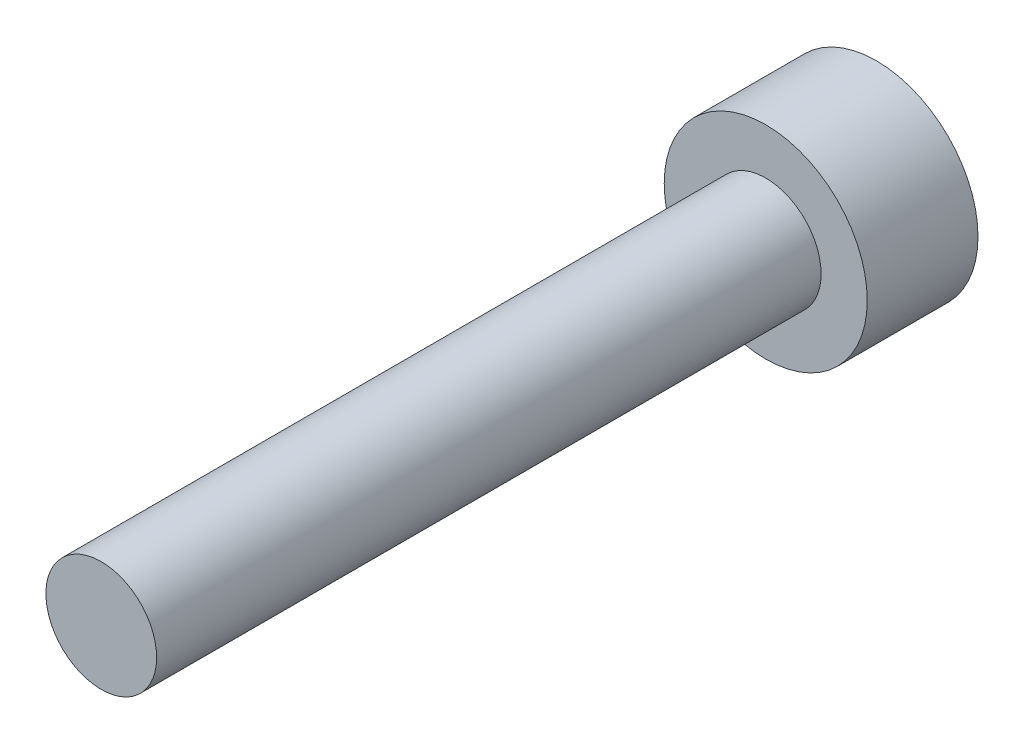
ISO-10303-21;
HEADER;
FILE_DESCRIPTION(('STEP AP214'),'2;1');
FILE_NAME('part.step','',(''),(''),'','','');
FILE_SCHEMA(('AUTOMOTIVE_DESIGN { 1 0 10303 214 1 1 1 1 }'));
ENDSEC;
DATA;
#1=APPLICATION_CONTEXT('core data for automotive mechanical design processes');
#2=APPLICATION_PROTOCOL_DEFINITION('international standard','automotive_design',2000,#1);
#3=PRODUCT_CONTEXT('',#1,'mechanical');
#4=PRODUCT('Part','Part','',(#3));
#5=PRODUCT_RELATED_PRODUCT_CATEGORY('part','',(#4));
#6=PRODUCT_DEFINITION_FORMATION('','',#4);
#7=PRODUCT_DEFINITION_CONTEXT('part definition',#1,'design');
#8=PRODUCT_DEFINITION('design','',#6,#7);
#9=PRODUCT_DEFINITION_SHAPE('','',#8);
#10=(LENGTH_UNIT() NAMED_UNIT(*) SI_UNIT(.MILLI.,.METRE.));
#11=(NAMED_UNIT(*) PLANE_ANGLE_UNIT() SI_UNIT($,.RADIAN.));
#12=(NAMED_UNIT(*) SI_UNIT($,.STERADIAN.) SOLID_ANGLE_UNIT());
#13=UNCERTAINTY_MEASURE_WITH_UNIT(LENGTH_MEASURE(1.E-05),#10,'distance_accuracy_value','');
#14=(GEOMETRIC_REPRESENTATION_CONTEXT(3) GLOBAL_UNCERTAINTY_ASSIGNED_CONTEXT((#13)) GLOBAL_UNIT_ASSIGNED_CONTEXT((#10,
#11,#12)) REPRESENTATION_CONTEXT('',''));
#15=CARTESIAN_POINT('',(0.,0.,0.));
#16=DIRECTION('',(0.,0.,1.));
#17=DIRECTION('',(1.,0.,0.));
#18=AXIS2_PLACEMENT_3D('',#15,#16,#17);
#19=CARTESIAN_POINT('',(0.,0.,-3.));
#20=DIRECTION('',(0.,0.,1.));
#21=DIRECTION('',(1.,0.,0.));
#22=AXIS2_PLACEMENT_3D('',#19,#20,#21);
#23=PLANE('',#22);
#24=CARTESIAN_POINT('',(0.,0.,-3.));
#25=DIRECTION('',(0.,0.,1.));
#26=DIRECTION('',(1.,0.,0.));
#27=AXIS2_PLACEMENT_3D('',#24,#25,#26);
#28=CIRCLE('',#27,2.75);
#29=CARTESIAN_POINT('',(2.75,0.,-3.));
#30=VERTEX_POINT('',#29);
#31=EDGE_CURVE('E112',#30,#30,#28,.T.);
#32=ORIENTED_EDGE('',*,*,#31,.F.);
#33=EDGE_LOOP('',(#32));
#34=FACE_BOUND('',#33,.T.);
#35=DIRECTION('',(-0.5,-0.866025403784439,0.));
#36=VECTOR('',#35,1.);
#37=CARTESIAN_POINT('',(1.08253175473055,-0.625,-3.));
#38=LINE('',#37,#36);
#39=CARTESIAN_POINT('',(1.44337567297406,0.,-3.));
#40=VERTEX_POINT('',#39);
#41=CARTESIAN_POINT('',(0.721687836487032,-1.25,-3.));
#42=VERTEX_POINT('',#41);
#43=EDGE_CURVE('E11',#40,#42,#38,.T.);
#44=ORIENTED_EDGE('',*,*,#43,.F.);
#45=DIRECTION('',(0.5,-0.866025403784439,0.));
#46=VECTOR('',#45,1.);
#47=CARTESIAN_POINT('',(1.08253175473055,0.625,-3.));
#48=LINE('',#47,#46);
#49=CARTESIAN_POINT('',(0.721687836487032,1.25,-3.));
#50=VERTEX_POINT('',#49);
#51=EDGE_CURVE('E50',#50,#40,#48,.T.);
#52=ORIENTED_EDGE('',*,*,#51,.F.);
#53=DIRECTION('',(1.,0.,0.));
#54=VECTOR('',#53,1.);
#55=CARTESIAN_POINT('',(0.,1.25,-3.));
#56=LINE('',#55,#54);
#57=CARTESIAN_POINT('',(-0.721687836487032,1.25,-3.));
#58=VERTEX_POINT('',#57);
#59=EDGE_CURVE('E133',#58,#50,#56,.T.);
#60=ORIENTED_EDGE('',*,*,#59,.F.);
#61=DIRECTION('',(0.5,0.866025403784439,0.));
#62=VECTOR('',#61,1.);
#63=CARTESIAN_POINT('',(-1.08253175473055,0.625,-3.));
#64=LINE('',#63,#62);
#65=CARTESIAN_POINT('',(-1.44337567297406,0.,-3.));
#66=VERTEX_POINT('',#65);
#67=EDGE_CURVE('E129',#66,#58,#64,.T.);
#68=ORIENTED_EDGE('',*,*,#67,.F.);
#69=DIRECTION('',(-0.5,0.866025403784439,0.));
#70=VECTOR('',#69,1.);
#71=CARTESIAN_POINT('',(-1.08253175473055,-0.624999999999999,-3.));
#72=LINE('',#71,#70);
#73=CARTESIAN_POINT('',(-0.721687836487033,-1.25,-3.));
#74=VERTEX_POINT('',#73);
#75=EDGE_CURVE('E130',#74,#66,#72,.T.);
#76=ORIENTED_EDGE('',*,*,#75,.F.);
#77=DIRECTION('',(-1.,0.,0.));
#78=VECTOR('',#77,1.);
#79=CARTESIAN_POINT('',(0.,-1.25,-3.));
#80=LINE('',#79,#78);
#81=EDGE_CURVE('E116',#42,#74,#80,.T.);
#82=ORIENTED_EDGE('',*,*,#81,.F.);
#83=EDGE_LOOP('',(#44,#52,#60,#68,#76,#82));
#84=FACE_BOUND('',#83,.T.);
#85=ADVANCED_FACE('F39',(#34,#84),#23,.F.);
#86=CARTESIAN_POINT('',(0.,0.,0.));
#87=DIRECTION('',(0.,0.,-1.));
#88=DIRECTION('',(-1.,0.,0.));
#89=AXIS2_PLACEMENT_3D('',#86,#87,#88);
#90=CYLINDRICAL_SURFACE('',#89,2.75);
#91=CARTESIAN_POINT('',(0.,0.,0.));
#92=DIRECTION('',(0.,0.,1.));
#93=DIRECTION('',(1.,0.,0.));
#94=AXIS2_PLACEMENT_3D('',#91,#92,#93);
#95=CIRCLE('',#94,2.75);
#96=CARTESIAN_POINT('',(2.75,0.,0.));
#97=VERTEX_POINT('',#96);
#98=EDGE_CURVE('E121',#97,#97,#95,.T.);
#99=ORIENTED_EDGE('',*,*,#98,.F.);
#100=EDGE_LOOP('',(#99));
#101=FACE_BOUND('',#100,.T.);
#102=ORIENTED_EDGE('',*,*,#31,.T.);
#103=EDGE_LOOP('',(#102));
#104=FACE_BOUND('',#103,.T.);
#105=ADVANCED_FACE('F41',(#101,#104),#90,.T.);
#106=CARTESIAN_POINT('',(0.,0.,0.));
#107=DIRECTION('',(0.,0.,1.));
#108=DIRECTION('',(1.,0.,0.));
#109=AXIS2_PLACEMENT_3D('',#106,#107,#108);
#110=PLANE('',#109);
#111=CARTESIAN_POINT('',(0.,0.,0.));
#112=DIRECTION('',(0.,0.,1.));
#113=DIRECTION('',(1.,0.,0.));
#114=AXIS2_PLACEMENT_3D('',#111,#112,#113);
#115=CIRCLE('',#114,1.5);
#116=CARTESIAN_POINT('',(1.5,0.,0.));
#117=VERTEX_POINT('',#116);
#118=EDGE_CURVE('E119',#117,#117,#115,.T.);
#119=ORIENTED_EDGE('',*,*,#118,.F.);
#120=EDGE_LOOP('',(#119));
#121=FACE_BOUND('',#120,.T.);
#122=ORIENTED_EDGE('',*,*,#98,.T.);
#123=EDGE_LOOP('',(#122));
#124=FACE_BOUND('',#123,.T.);
#125=ADVANCED_FACE('F177',(#121,#124),#110,.T.);
#126=CARTESIAN_POINT('',(0.,0.,18.));
#127=DIRECTION('',(0.,0.,-1.));
#128=DIRECTION('',(-1.,0.,0.));
#129=AXIS2_PLACEMENT_3D('',#126,#127,#128);
#130=CYLINDRICAL_SURFACE('',#129,1.5);
#131=CARTESIAN_POINT('',(0.,0.,18.));
#132=DIRECTION('',(0.,0.,1.));
#133=DIRECTION('',(1.,0.,0.));
#134=AXIS2_PLACEMENT_3D('',#131,#132,#133);
#135=CIRCLE('',#134,1.5);
#136=CARTESIAN_POINT('',(1.5,0.,18.));
#137=VERTEX_POINT('',#136);
#138=EDGE_CURVE('E110',#137,#137,#135,.T.);
#139=ORIENTED_EDGE('',*,*,#138,.F.);
#140=EDGE_LOOP('',(#139));
#141=FACE_BOUND('',#140,.T.);
#142=ORIENTED_EDGE('',*,*,#118,.T.);
#143=EDGE_LOOP('',(#142));
#144=FACE_BOUND('',#143,.T.);
#145=ADVANCED_FACE('F184',(#141,#144),#130,.T.);
#146=CARTESIAN_POINT('',(0.,0.,18.));
#147=DIRECTION('',(0.,0.,1.));
#148=DIRECTION('',(1.,0.,0.));
#149=AXIS2_PLACEMENT_3D('',#146,#147,#148);
#150=PLANE('',#149);
#151=ORIENTED_EDGE('',*,*,#138,.T.);
#152=EDGE_LOOP('',(#151));
#153=FACE_BOUND('',#152,.T.);
#154=ADVANCED_FACE('F187',(#153),#150,.T.);
#155=CARTESIAN_POINT('',(0.721687836487032,-1.25,-1.35));
#156=DIRECTION('',(-0.866025403784439,0.5,0.));
#157=DIRECTION('',(-0.5,-0.866025403784439,0.));
#158=AXIS2_PLACEMENT_3D('',#155,#156,#157);
#159=PLANE('',#158);
#160=ORIENTED_EDGE('',*,*,#43,.T.);
#161=DIRECTION('',(0.,0.,-1.));
#162=VECTOR('',#161,1.);
#163=CARTESIAN_POINT('',(0.721687836487032,-1.25,-1.35));
#164=LINE('',#163,#162);
#165=CARTESIAN_POINT('',(0.721687836487032,-1.25,-1.35));
#166=VERTEX_POINT('',#165);
#167=EDGE_CURVE('E53',#166,#42,#164,.T.);
#168=ORIENTED_EDGE('',*,*,#167,.F.);
#169=DIRECTION('',(0.5,0.866025403784439,0.));
#170=VECTOR('',#169,1.);
#171=CARTESIAN_POINT('',(0.721687836487032,-1.25,-1.35));
#172=LINE('',#171,#170);
#173=CARTESIAN_POINT('',(1.44337567297406,0.,-1.35));
#174=VERTEX_POINT('',#173);
#175=EDGE_CURVE('E96',#166,#174,#172,.T.);
#176=ORIENTED_EDGE('',*,*,#175,.T.);
#177=DIRECTION('',(0.,0.,-1.));
#178=VECTOR('',#177,1.);
#179=CARTESIAN_POINT('',(1.44337567297406,0.,-1.35));
#180=LINE('',#179,#178);
#181=EDGE_CURVE('E103',#174,#40,#180,.T.);
#182=ORIENTED_EDGE('',*,*,#181,.T.);
#183=EDGE_LOOP('',(#160,#168,#176,#182));
#184=FACE_BOUND('',#183,.T.);
#185=ADVANCED_FACE('F105',(#184),#159,.T.);
#186=CARTESIAN_POINT('',(1.44337567297406,0.,-1.35));
#187=DIRECTION('',(-0.866025403784439,-0.5,0.));
#188=DIRECTION('',(0.5,-0.866025403784439,0.));
#189=AXIS2_PLACEMENT_3D('',#186,#187,#188);
#190=PLANE('',#189);
#191=ORIENTED_EDGE('',*,*,#51,.T.);
#192=ORIENTED_EDGE('',*,*,#181,.F.);
#193=DIRECTION('',(-0.5,0.866025403784439,0.));
#194=VECTOR('',#193,1.);
#195=CARTESIAN_POINT('',(1.44337567297406,0.,-1.35));
#196=LINE('',#195,#194);
#197=CARTESIAN_POINT('',(0.721687836487032,1.25,-1.35));
#198=VERTEX_POINT('',#197);
#199=EDGE_CURVE('E95',#174,#198,#196,.T.);
#200=ORIENTED_EDGE('',*,*,#199,.T.);
#201=DIRECTION('',(0.,0.,-1.));
#202=VECTOR('',#201,1.);
#203=CARTESIAN_POINT('',(0.721687836487032,1.25,-1.35));
#204=LINE('',#203,#202);
#205=EDGE_CURVE('E107',#198,#50,#204,.T.);
#206=ORIENTED_EDGE('',*,*,#205,.T.);
#207=EDGE_LOOP('',(#191,#192,#200,#206));
#208=FACE_BOUND('',#207,.T.);
#209=ADVANCED_FACE('F106',(#208),#190,.T.);
#210=CARTESIAN_POINT('',(0.721687836487032,1.25,-1.35));
#211=DIRECTION('',(0.,-1.,0.));
#212=DIRECTION('',(1.,0.,0.));
#213=AXIS2_PLACEMENT_3D('',#210,#211,#212);
#214=PLANE('',#213);
#215=ORIENTED_EDGE('',*,*,#59,.T.);
#216=ORIENTED_EDGE('',*,*,#205,.F.);
#217=DIRECTION('',(-1.,0.,0.));
#218=VECTOR('',#217,1.);
#219=CARTESIAN_POINT('',(0.721687836487032,1.25,-1.35));
#220=LINE('',#219,#218);
#221=CARTESIAN_POINT('',(-0.721687836487032,1.25,-1.35));
#222=VERTEX_POINT('',#221);
#223=EDGE_CURVE('E98',#198,#222,#220,.T.);
#224=ORIENTED_EDGE('',*,*,#223,.T.);
#225=DIRECTION('',(0.,0.,-1.));
#226=VECTOR('',#225,1.);
#227=CARTESIAN_POINT('',(-0.721687836487032,1.25,-1.35));
#228=LINE('',#227,#226);
#229=EDGE_CURVE('E114',#222,#58,#228,.T.);
#230=ORIENTED_EDGE('',*,*,#229,.T.);
#231=EDGE_LOOP('',(#215,#216,#224,#230));
#232=FACE_BOUND('',#231,.T.);
#233=ADVANCED_FACE('F131',(#232),#214,.T.);
#234=CARTESIAN_POINT('',(-0.721687836487032,1.25,-1.35));
#235=DIRECTION('',(0.866025403784439,-0.5,0.));
#236=DIRECTION('',(0.5,0.866025403784439,0.));
#237=AXIS2_PLACEMENT_3D('',#234,#235,#236);
#238=PLANE('',#237);
#239=ORIENTED_EDGE('',*,*,#67,.T.);
#240=ORIENTED_EDGE('',*,*,#229,.F.);
#241=DIRECTION('',(-0.5,-0.866025403784439,0.));
#242=VECTOR('',#241,1.);
#243=CARTESIAN_POINT('',(-0.721687836487032,1.25,-1.35));
#244=LINE('',#243,#242);
#245=CARTESIAN_POINT('',(-1.44337567297406,0.,-1.35));
#246=VERTEX_POINT('',#245);
#247=EDGE_CURVE('E157',#222,#246,#244,.T.);
#248=ORIENTED_EDGE('',*,*,#247,.T.);
#249=DIRECTION('',(0.,0.,-1.));
#250=VECTOR('',#249,1.);
#251=CARTESIAN_POINT('',(-1.44337567297406,0.,-1.35));
#252=LINE('',#251,#250);
#253=EDGE_CURVE('E151',#246,#66,#252,.T.);
#254=ORIENTED_EDGE('',*,*,#253,.T.);
#255=EDGE_LOOP('',(#239,#240,#248,#254));
#256=FACE_BOUND('',#255,.T.);
#257=ADVANCED_FACE('F165',(#256),#238,.T.);
#258=CARTESIAN_POINT('',(-1.44337567297406,0.,-1.35));
#259=DIRECTION('',(0.866025403784439,0.5,0.));
#260=DIRECTION('',(-0.5,0.866025403784439,0.));
#261=AXIS2_PLACEMENT_3D('',#258,#259,#260);
#262=PLANE('',#261);
#263=ORIENTED_EDGE('',*,*,#75,.T.);
#264=ORIENTED_EDGE('',*,*,#253,.F.);
#265=DIRECTION('',(0.5,-0.866025403784439,0.));
#266=VECTOR('',#265,1.);
#267=CARTESIAN_POINT('',(-1.44337567297406,0.,-1.35));
#268=LINE('',#267,#266);
#269=CARTESIAN_POINT('',(-0.721687836487033,-1.25,-1.35));
#270=VERTEX_POINT('',#269);
#271=EDGE_CURVE('E147',#246,#270,#268,.T.);
#272=ORIENTED_EDGE('',*,*,#271,.T.);
#273=DIRECTION('',(0.,0.,-1.));
#274=VECTOR('',#273,1.);
#275=CARTESIAN_POINT('',(-0.721687836487033,-1.25,-1.35));
#276=LINE('',#275,#274);
#277=EDGE_CURVE('E145',#270,#74,#276,.T.);
#278=ORIENTED_EDGE('',*,*,#277,.T.);
#279=EDGE_LOOP('',(#263,#264,#272,#278));
#280=FACE_BOUND('',#279,.T.);
#281=ADVANCED_FACE('F148',(#280),#262,.T.);
#282=CARTESIAN_POINT('',(-0.721687836487033,-1.25,-1.35));
#283=DIRECTION('',(0.,1.,0.));
#284=DIRECTION('',(-1.,0.,0.));
#285=AXIS2_PLACEMENT_3D('',#282,#283,#284);
#286=PLANE('',#285);
#287=ORIENTED_EDGE('',*,*,#81,.T.);
#288=ORIENTED_EDGE('',*,*,#277,.F.);
#289=DIRECTION('',(1.,0.,0.));
#290=VECTOR('',#289,1.);
#291=CARTESIAN_POINT('',(-0.721687836487033,-1.25,-1.35));
#292=LINE('',#291,#290);
#293=EDGE_CURVE('E152',#270,#166,#292,.T.);
#294=ORIENTED_EDGE('',*,*,#293,.T.);
#295=ORIENTED_EDGE('',*,*,#167,.T.);
#296=EDGE_LOOP('',(#287,#288,#294,#295));
#297=FACE_BOUND('',#296,.T.);
#298=ADVANCED_FACE('F141',(#297),#286,.T.);
#299=CARTESIAN_POINT('',(0.,0.,-1.35));
#300=DIRECTION('',(0.,0.,1.));
#301=DIRECTION('',(1.,0.,0.));
#302=AXIS2_PLACEMENT_3D('',#299,#300,#301);
#303=PLANE('',#302);
#304=ORIENTED_EDGE('',*,*,#175,.F.);
#305=ORIENTED_EDGE('',*,*,#293,.F.);
#306=ORIENTED_EDGE('',*,*,#271,.F.);
#307=ORIENTED_EDGE('',*,*,#247,.F.);
#308=ORIENTED_EDGE('',*,*,#223,.F.);
#309=ORIENTED_EDGE('',*,*,#199,.F.);
#310=EDGE_LOOP('',(#304,#305,#306,#307,#308,#309));
#311=FACE_BOUND('',#310,.T.);
#312=ADVANCED_FACE('F94',(#311),#303,.F.);
#313=CLOSED_SHELL('',(#85,#105,#125,#145,#154,#185,#209,#233,#257,#281,#298,#312));
#314=MANIFOLD_SOLID_BREP('B2',#313);
#315=ADVANCED_BREP_SHAPE_REPRESENTATION('',(#18,#314),#14);
#316=SHAPE_DEFINITION_REPRESENTATION(#9,#315);
ENDSEC;
END-ISO-10303-21;
